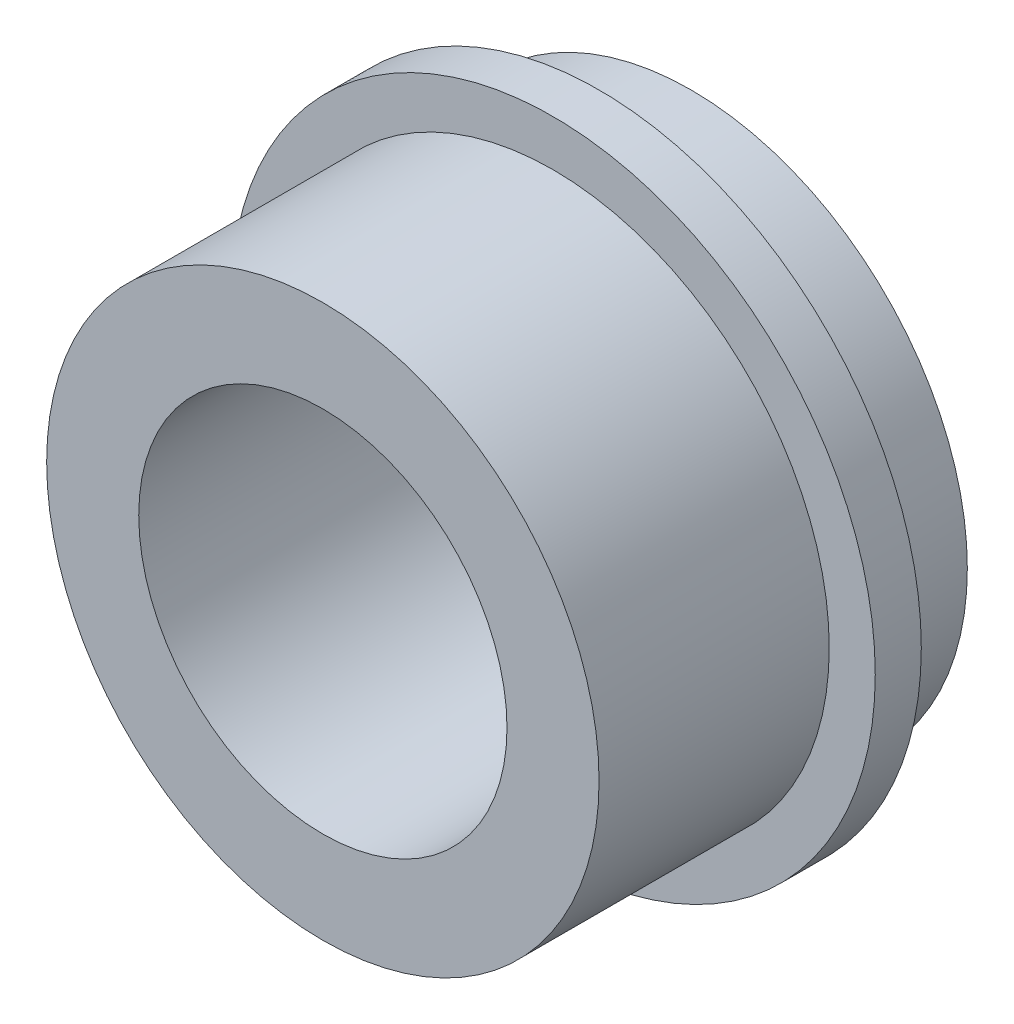
ISO-10303-21;
HEADER;
FILE_DESCRIPTION(('STEP AP214'),'2;1');
FILE_NAME('part.step','',(''),(''),'','','');
FILE_SCHEMA(('AUTOMOTIVE_DESIGN { 1 0 10303 214 1 1 1 1 }'));
ENDSEC;
DATA;
#1=APPLICATION_CONTEXT('core data for automotive mechanical design processes');
#2=APPLICATION_PROTOCOL_DEFINITION('international standard','automotive_design',2000,#1);
#3=PRODUCT_CONTEXT('',#1,'mechanical');
#4=PRODUCT('Part','Part','',(#3));
#5=PRODUCT_RELATED_PRODUCT_CATEGORY('part','',(#4));
#6=PRODUCT_DEFINITION_FORMATION('','',#4);
#7=PRODUCT_DEFINITION_CONTEXT('part definition',#1,'design');
#8=PRODUCT_DEFINITION('design','',#6,#7);
#9=PRODUCT_DEFINITION_SHAPE('','',#8);
#10=(LENGTH_UNIT() NAMED_UNIT(*) SI_UNIT(.MILLI.,.METRE.));
#11=(NAMED_UNIT(*) PLANE_ANGLE_UNIT() SI_UNIT($,.RADIAN.));
#12=(NAMED_UNIT(*) SI_UNIT($,.STERADIAN.) SOLID_ANGLE_UNIT());
#13=UNCERTAINTY_MEASURE_WITH_UNIT(LENGTH_MEASURE(1.E-05),#10,'distance_accuracy_value','');
#14=(GEOMETRIC_REPRESENTATION_CONTEXT(3) GLOBAL_UNCERTAINTY_ASSIGNED_CONTEXT((#13)) GLOBAL_UNIT_ASSIGNED_CONTEXT((#10,
#11,#12)) REPRESENTATION_CONTEXT('',''));
#15=CARTESIAN_POINT('',(0.,0.,0.));
#16=DIRECTION('',(0.,0.,1.));
#17=DIRECTION('',(1.,0.,0.));
#18=AXIS2_PLACEMENT_3D('',#15,#16,#17);
#19=CARTESIAN_POINT('',(0.,0.,8.));
#20=DIRECTION('',(0.,0.,-1.));
#21=DIRECTION('',(-1.,0.,0.));
#22=AXIS2_PLACEMENT_3D('',#19,#20,#21);
#23=CYLINDRICAL_SURFACE('',#22,6.);
#24=CARTESIAN_POINT('',(0.,0.,0.));
#25=DIRECTION('',(0.,0.,1.));
#26=DIRECTION('',(1.,0.,0.));
#27=AXIS2_PLACEMENT_3D('',#24,#25,#26);
#28=CIRCLE('',#27,6.);
#29=CARTESIAN_POINT('',(6.,0.,0.));
#30=VERTEX_POINT('',#29);
#31=EDGE_CURVE('E41',#30,#30,#28,.T.);
#32=ORIENTED_EDGE('',*,*,#31,.T.);
#33=EDGE_LOOP('',(#32));
#34=FACE_BOUND('',#33,.T.);
#35=CARTESIAN_POINT('',(0.,0.,2.));
#36=DIRECTION('',(0.,0.,1.));
#37=DIRECTION('',(1.,0.,0.));
#38=AXIS2_PLACEMENT_3D('',#35,#36,#37);
#39=CIRCLE('',#38,6.);
#40=CARTESIAN_POINT('',(6.,0.,2.));
#41=VERTEX_POINT('',#40);
#42=EDGE_CURVE('E10',#41,#41,#39,.T.);
#43=ORIENTED_EDGE('',*,*,#42,.F.);
#44=EDGE_LOOP('',(#43));
#45=FACE_BOUND('',#44,.T.);
#46=ADVANCED_FACE('F37',(#34,#45),#23,.T.);
#47=CARTESIAN_POINT('',(0.,0.,8.));
#48=DIRECTION('',(0.,0.,1.));
#49=DIRECTION('',(1.,0.,0.));
#50=AXIS2_PLACEMENT_3D('',#47,#48,#49);
#51=PLANE('',#50);
#52=CARTESIAN_POINT('',(0.,0.,8.));
#53=DIRECTION('',(0.,0.,1.));
#54=DIRECTION('',(1.,0.,0.));
#55=AXIS2_PLACEMENT_3D('',#52,#53,#54);
#56=CIRCLE('',#55,6.);
#57=CARTESIAN_POINT('',(6.,0.,8.));
#58=VERTEX_POINT('',#57);
#59=EDGE_CURVE('E45',#58,#58,#56,.T.);
#60=ORIENTED_EDGE('',*,*,#59,.T.);
#61=EDGE_LOOP('',(#60));
#62=FACE_BOUND('',#61,.T.);
#63=CARTESIAN_POINT('',(0.,0.,8.));
#64=DIRECTION('',(0.,0.,1.));
#65=DIRECTION('',(1.,0.,0.));
#66=AXIS2_PLACEMENT_3D('',#63,#64,#65);
#67=CIRCLE('',#66,4.);
#68=CARTESIAN_POINT('',(4.,0.,8.));
#69=VERTEX_POINT('',#68);
#70=EDGE_CURVE('E54',#69,#69,#67,.T.);
#71=ORIENTED_EDGE('',*,*,#70,.F.);
#72=EDGE_LOOP('',(#71));
#73=FACE_BOUND('',#72,.T.);
#74=ADVANCED_FACE('F86',(#62,#73),#51,.T.);
#75=CARTESIAN_POINT('',(0.,0.,0.));
#76=DIRECTION('',(0.,0.,1.));
#77=DIRECTION('',(1.,0.,0.));
#78=AXIS2_PLACEMENT_3D('',#75,#76,#77);
#79=PLANE('',#78);
#80=ORIENTED_EDGE('',*,*,#31,.F.);
#81=EDGE_LOOP('',(#80));
#82=FACE_BOUND('',#81,.T.);
#83=CARTESIAN_POINT('',(0.,0.,0.));
#84=DIRECTION('',(0.,0.,1.));
#85=DIRECTION('',(1.,0.,0.));
#86=AXIS2_PLACEMENT_3D('',#83,#84,#85);
#87=CIRCLE('',#86,4.);
#88=CARTESIAN_POINT('',(4.,0.,0.));
#89=VERTEX_POINT('',#88);
#90=EDGE_CURVE('E57',#89,#89,#87,.T.);
#91=ORIENTED_EDGE('',*,*,#90,.T.);
#92=EDGE_LOOP('',(#91));
#93=FACE_BOUND('',#92,.T.);
#94=ADVANCED_FACE('F93',(#82,#93),#79,.F.);
#95=CARTESIAN_POINT('',(0.,0.,3.));
#96=DIRECTION('',(0.,0.,1.));
#97=DIRECTION('',(1.,0.,0.));
#98=AXIS2_PLACEMENT_3D('',#95,#96,#97);
#99=CIRCLE('',#98,6.);
#100=CARTESIAN_POINT('',(6.,0.,3.));
#101=VERTEX_POINT('',#100);
#102=EDGE_CURVE('E52',#101,#101,#99,.T.);
#103=ORIENTED_EDGE('',*,*,#102,.T.);
#104=EDGE_LOOP('',(#103));
#105=FACE_BOUND('',#104,.T.);
#106=ORIENTED_EDGE('',*,*,#59,.F.);
#107=EDGE_LOOP('',(#106));
#108=FACE_BOUND('',#107,.T.);
#109=ADVANCED_FACE('F39',(#105,#108),#23,.T.);
#110=CARTESIAN_POINT('',(0.,0.,8.));
#111=DIRECTION('',(0.,0.,-1.));
#112=DIRECTION('',(-1.,0.,0.));
#113=AXIS2_PLACEMENT_3D('',#110,#111,#112);
#114=CYLINDRICAL_SURFACE('',#113,4.);
#115=ORIENTED_EDGE('',*,*,#70,.T.);
#116=EDGE_LOOP('',(#115));
#117=FACE_BOUND('',#116,.T.);
#118=ORIENTED_EDGE('',*,*,#90,.F.);
#119=EDGE_LOOP('',(#118));
#120=FACE_BOUND('',#119,.T.);
#121=ADVANCED_FACE('F98',(#117,#120),#114,.F.);
#122=CARTESIAN_POINT('',(0.,0.,2.));
#123=DIRECTION('',(0.,0.,1.));
#124=DIRECTION('',(1.,0.,0.));
#125=AXIS2_PLACEMENT_3D('',#122,#123,#124);
#126=PLANE('',#125);
#127=CARTESIAN_POINT('',(0.,0.,2.));
#128=DIRECTION('',(0.,0.,1.));
#129=DIRECTION('',(1.,0.,0.));
#130=AXIS2_PLACEMENT_3D('',#127,#128,#129);
#131=CIRCLE('',#130,7.);
#132=CARTESIAN_POINT('',(7.,0.,2.));
#133=VERTEX_POINT('',#132);
#134=EDGE_CURVE('E62',#133,#133,#131,.T.);
#135=ORIENTED_EDGE('',*,*,#134,.F.);
#136=EDGE_LOOP('',(#135));
#137=FACE_BOUND('',#136,.T.);
#138=ORIENTED_EDGE('',*,*,#42,.T.);
#139=EDGE_LOOP('',(#138));
#140=FACE_BOUND('',#139,.T.);
#141=ADVANCED_FACE('F82',(#137,#140),#126,.F.);
#142=CARTESIAN_POINT('',(0.,0.,3.));
#143=DIRECTION('',(0.,0.,1.));
#144=DIRECTION('',(1.,0.,0.));
#145=AXIS2_PLACEMENT_3D('',#142,#143,#144);
#146=PLANE('',#145);
#147=CARTESIAN_POINT('',(0.,0.,3.));
#148=DIRECTION('',(0.,0.,1.));
#149=DIRECTION('',(1.,0.,0.));
#150=AXIS2_PLACEMENT_3D('',#147,#148,#149);
#151=CIRCLE('',#150,7.);
#152=CARTESIAN_POINT('',(7.,0.,3.));
#153=VERTEX_POINT('',#152);
#154=EDGE_CURVE('E66',#153,#153,#151,.T.);
#155=ORIENTED_EDGE('',*,*,#154,.T.);
#156=EDGE_LOOP('',(#155));
#157=FACE_BOUND('',#156,.T.);
#158=ORIENTED_EDGE('',*,*,#102,.F.);
#159=EDGE_LOOP('',(#158));
#160=FACE_BOUND('',#159,.T.);
#161=ADVANCED_FACE('F73',(#157,#160),#146,.T.);
#162=CARTESIAN_POINT('',(0.,0.,2.));
#163=DIRECTION('',(0.,0.,1.));
#164=DIRECTION('',(1.,0.,0.));
#165=AXIS2_PLACEMENT_3D('',#162,#163,#164);
#166=CYLINDRICAL_SURFACE('',#165,7.);
#167=ORIENTED_EDGE('',*,*,#134,.T.);
#168=EDGE_LOOP('',(#167));
#169=FACE_BOUND('',#168,.T.);
#170=ORIENTED_EDGE('',*,*,#154,.F.);
#171=EDGE_LOOP('',(#170));
#172=FACE_BOUND('',#171,.T.);
#173=ADVANCED_FACE('F76',(#169,#172),#166,.T.);
#174=CLOSED_SHELL('',(#46,#74,#94,#109,#121,#141,#161,#173));
#175=MANIFOLD_SOLID_BREP('B2',#174);
#176=ADVANCED_BREP_SHAPE_REPRESENTATION('',(#18,#175),#14);
#177=SHAPE_DEFINITION_REPRESENTATION(#9,#176);
ENDSEC;
END-ISO-10303-21;
